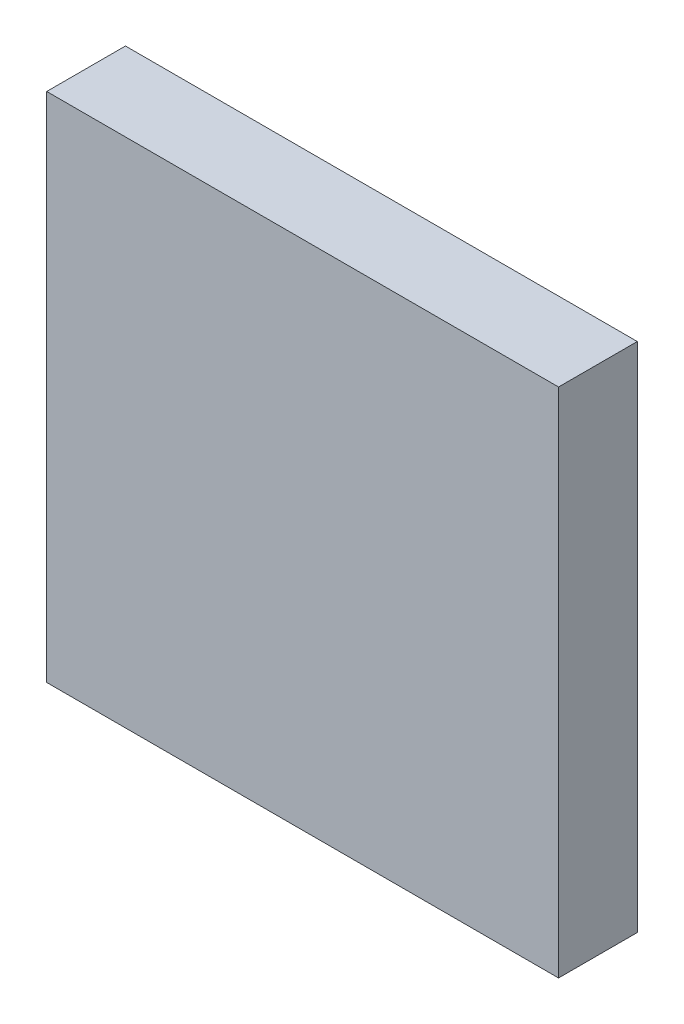
ISO-10303-21;
HEADER;
FILE_DESCRIPTION(('STEP AP214'),'2;1');
FILE_NAME('part.step','',(''),(''),'','','');
FILE_SCHEMA(('AUTOMOTIVE_DESIGN { 1 0 10303 214 1 1 1 1 }'));
ENDSEC;
DATA;
#1=APPLICATION_CONTEXT('core data for automotive mechanical design processes');
#2=APPLICATION_PROTOCOL_DEFINITION('international standard','automotive_design',2000,#1);
#3=PRODUCT_CONTEXT('',#1,'mechanical');
#4=PRODUCT('Part','Part','',(#3));
#5=PRODUCT_RELATED_PRODUCT_CATEGORY('part','',(#4));
#6=PRODUCT_DEFINITION_FORMATION('','',#4);
#7=PRODUCT_DEFINITION_CONTEXT('part definition',#1,'design');
#8=PRODUCT_DEFINITION('design','',#6,#7);
#9=PRODUCT_DEFINITION_SHAPE('','',#8);
#10=(LENGTH_UNIT() NAMED_UNIT(*) SI_UNIT(.MILLI.,.METRE.));
#11=(NAMED_UNIT(*) PLANE_ANGLE_UNIT() SI_UNIT($,.RADIAN.));
#12=(NAMED_UNIT(*) SI_UNIT($,.STERADIAN.) SOLID_ANGLE_UNIT());
#13=UNCERTAINTY_MEASURE_WITH_UNIT(LENGTH_MEASURE(1.E-05),#10,'distance_accuracy_value','');
#14=(GEOMETRIC_REPRESENTATION_CONTEXT(3) GLOBAL_UNCERTAINTY_ASSIGNED_CONTEXT((#13)) GLOBAL_UNIT_ASSIGNED_CONTEXT((#10,
#11,#12)) REPRESENTATION_CONTEXT('',''));
#15=CARTESIAN_POINT('',(0.,0.,0.));
#16=DIRECTION('',(0.,0.,1.));
#17=DIRECTION('',(1.,0.,0.));
#18=AXIS2_PLACEMENT_3D('',#15,#16,#17);
#19=CARTESIAN_POINT('',(41.275,41.275,12.7));
#20=DIRECTION('',(-1.,0.,0.));
#21=DIRECTION('',(0.,-1.,0.));
#22=AXIS2_PLACEMENT_3D('',#19,#20,#21);
#23=PLANE('',#22);
#24=DIRECTION('',(0.,1.,0.));
#25=VECTOR('',#24,1.);
#26=CARTESIAN_POINT('',(41.275,41.275,0.));
#27=LINE('',#26,#25);
#28=CARTESIAN_POINT('',(41.275,-41.275,0.));
#29=VERTEX_POINT('',#28);
#30=CARTESIAN_POINT('',(41.275,41.275,0.));
#31=VERTEX_POINT('',#30);
#32=EDGE_CURVE('E97',#29,#31,#27,.T.);
#33=ORIENTED_EDGE('',*,*,#32,.T.);
#34=DIRECTION('',(0.,0.,-1.));
#35=VECTOR('',#34,1.);
#36=CARTESIAN_POINT('',(41.275,41.275,12.7));
#37=LINE('',#36,#35);
#38=CARTESIAN_POINT('',(41.275,41.275,12.7));
#39=VERTEX_POINT('',#38);
#40=EDGE_CURVE('E11',#39,#31,#37,.T.);
#41=ORIENTED_EDGE('',*,*,#40,.F.);
#42=DIRECTION('',(0.,1.,0.));
#43=VECTOR('',#42,1.);
#44=CARTESIAN_POINT('',(41.275,41.275,12.7));
#45=LINE('',#44,#43);
#46=CARTESIAN_POINT('',(41.275,-41.275,12.7));
#47=VERTEX_POINT('',#46);
#48=EDGE_CURVE('E85',#47,#39,#45,.T.);
#49=ORIENTED_EDGE('',*,*,#48,.F.);
#50=DIRECTION('',(0.,0.,-1.));
#51=VECTOR('',#50,1.);
#52=CARTESIAN_POINT('',(41.275,-41.275,12.7));
#53=LINE('',#52,#51);
#54=EDGE_CURVE('E93',#47,#29,#53,.T.);
#55=ORIENTED_EDGE('',*,*,#54,.T.);
#56=EDGE_LOOP('',(#33,#41,#49,#55));
#57=FACE_BOUND('',#56,.T.);
#58=ADVANCED_FACE('F34',(#57),#23,.F.);
#59=CARTESIAN_POINT('',(-41.275,41.275,12.7));
#60=DIRECTION('',(0.,-1.,0.));
#61=DIRECTION('',(0.,0.,-1.));
#62=AXIS2_PLACEMENT_3D('',#59,#60,#61);
#63=PLANE('',#62);
#64=DIRECTION('',(-1.,0.,0.));
#65=VECTOR('',#64,1.);
#66=CARTESIAN_POINT('',(-41.275,41.275,0.));
#67=LINE('',#66,#65);
#68=CARTESIAN_POINT('',(-41.275,41.275,0.));
#69=VERTEX_POINT('',#68);
#70=EDGE_CURVE('E89',#31,#69,#67,.T.);
#71=ORIENTED_EDGE('',*,*,#70,.T.);
#72=DIRECTION('',(0.,0.,-1.));
#73=VECTOR('',#72,1.);
#74=CARTESIAN_POINT('',(-41.275,41.275,12.7));
#75=LINE('',#74,#73);
#76=CARTESIAN_POINT('',(-41.275,41.275,12.7));
#77=VERTEX_POINT('',#76);
#78=EDGE_CURVE('E42',#77,#69,#75,.T.);
#79=ORIENTED_EDGE('',*,*,#78,.F.);
#80=DIRECTION('',(-1.,0.,0.));
#81=VECTOR('',#80,1.);
#82=CARTESIAN_POINT('',(-41.275,41.275,12.7));
#83=LINE('',#82,#81);
#84=EDGE_CURVE('E80',#39,#77,#83,.T.);
#85=ORIENTED_EDGE('',*,*,#84,.F.);
#86=ORIENTED_EDGE('',*,*,#40,.T.);
#87=EDGE_LOOP('',(#71,#79,#85,#86));
#88=FACE_BOUND('',#87,.T.);
#89=ADVANCED_FACE('F88',(#88),#63,.F.);
#90=CARTESIAN_POINT('',(-41.275,41.275,12.7));
#91=DIRECTION('',(1.,0.,0.));
#92=DIRECTION('',(0.,1.,0.));
#93=AXIS2_PLACEMENT_3D('',#90,#91,#92);
#94=PLANE('',#93);
#95=DIRECTION('',(0.,-1.,0.));
#96=VECTOR('',#95,1.);
#97=CARTESIAN_POINT('',(-41.275,41.275,0.));
#98=LINE('',#97,#96);
#99=CARTESIAN_POINT('',(-41.275,-41.275,0.));
#100=VERTEX_POINT('',#99);
#101=EDGE_CURVE('E67',#69,#100,#98,.T.);
#102=ORIENTED_EDGE('',*,*,#101,.T.);
#103=DIRECTION('',(0.,0.,-1.));
#104=VECTOR('',#103,1.);
#105=CARTESIAN_POINT('',(-41.275,-41.275,12.7));
#106=LINE('',#105,#104);
#107=CARTESIAN_POINT('',(-41.275,-41.275,12.7));
#108=VERTEX_POINT('',#107);
#109=EDGE_CURVE('E90',#108,#100,#106,.T.);
#110=ORIENTED_EDGE('',*,*,#109,.F.);
#111=DIRECTION('',(0.,-1.,0.));
#112=VECTOR('',#111,1.);
#113=CARTESIAN_POINT('',(-41.275,41.275,12.7));
#114=LINE('',#113,#112);
#115=EDGE_CURVE('E83',#77,#108,#114,.T.);
#116=ORIENTED_EDGE('',*,*,#115,.F.);
#117=ORIENTED_EDGE('',*,*,#78,.T.);
#118=EDGE_LOOP('',(#102,#110,#116,#117));
#119=FACE_BOUND('',#118,.T.);
#120=ADVANCED_FACE('F91',(#119),#94,.F.);
#121=CARTESIAN_POINT('',(-41.275,-41.275,12.7));
#122=DIRECTION('',(0.,1.,0.));
#123=DIRECTION('',(0.,0.,1.));
#124=AXIS2_PLACEMENT_3D('',#121,#122,#123);
#125=PLANE('',#124);
#126=DIRECTION('',(1.,0.,0.));
#127=VECTOR('',#126,1.);
#128=CARTESIAN_POINT('',(-41.275,-41.275,0.));
#129=LINE('',#128,#127);
#130=EDGE_CURVE('E73',#100,#29,#129,.T.);
#131=ORIENTED_EDGE('',*,*,#130,.T.);
#132=ORIENTED_EDGE('',*,*,#54,.F.);
#133=DIRECTION('',(1.,0.,0.));
#134=VECTOR('',#133,1.);
#135=CARTESIAN_POINT('',(-41.275,-41.275,12.7));
#136=LINE('',#135,#134);
#137=EDGE_CURVE('E50',#108,#47,#136,.T.);
#138=ORIENTED_EDGE('',*,*,#137,.F.);
#139=ORIENTED_EDGE('',*,*,#109,.T.);
#140=EDGE_LOOP('',(#131,#132,#138,#139));
#141=FACE_BOUND('',#140,.T.);
#142=ADVANCED_FACE('F104',(#141),#125,.F.);
#143=CARTESIAN_POINT('',(0.,0.,12.7));
#144=DIRECTION('',(0.,0.,1.));
#145=DIRECTION('',(1.,0.,0.));
#146=AXIS2_PLACEMENT_3D('',#143,#144,#145);
#147=PLANE('',#146);
#148=ORIENTED_EDGE('',*,*,#48,.T.);
#149=ORIENTED_EDGE('',*,*,#84,.T.);
#150=ORIENTED_EDGE('',*,*,#115,.T.);
#151=ORIENTED_EDGE('',*,*,#137,.T.);
#152=EDGE_LOOP('',(#148,#149,#150,#151));
#153=FACE_BOUND('',#152,.T.);
#154=ADVANCED_FACE('F81',(#153),#147,.T.);
#155=CARTESIAN_POINT('',(0.,0.,0.));
#156=DIRECTION('',(0.,0.,1.));
#157=DIRECTION('',(1.,0.,0.));
#158=AXIS2_PLACEMENT_3D('',#155,#156,#157);
#159=PLANE('',#158);
#160=ORIENTED_EDGE('',*,*,#32,.F.);
#161=ORIENTED_EDGE('',*,*,#130,.F.);
#162=ORIENTED_EDGE('',*,*,#101,.F.);
#163=ORIENTED_EDGE('',*,*,#70,.F.);
#164=EDGE_LOOP('',(#160,#161,#162,#163));
#165=FACE_BOUND('',#164,.T.);
#166=ADVANCED_FACE('F107',(#165),#159,.F.);
#167=CLOSED_SHELL('',(#58,#89,#120,#142,#154,#166));
#168=MANIFOLD_SOLID_BREP('B2',#167);
#169=ADVANCED_BREP_SHAPE_REPRESENTATION('',(#18,#168),#14);
#170=SHAPE_DEFINITION_REPRESENTATION(#9,#169);
ENDSEC;
END-ISO-10303-21;
